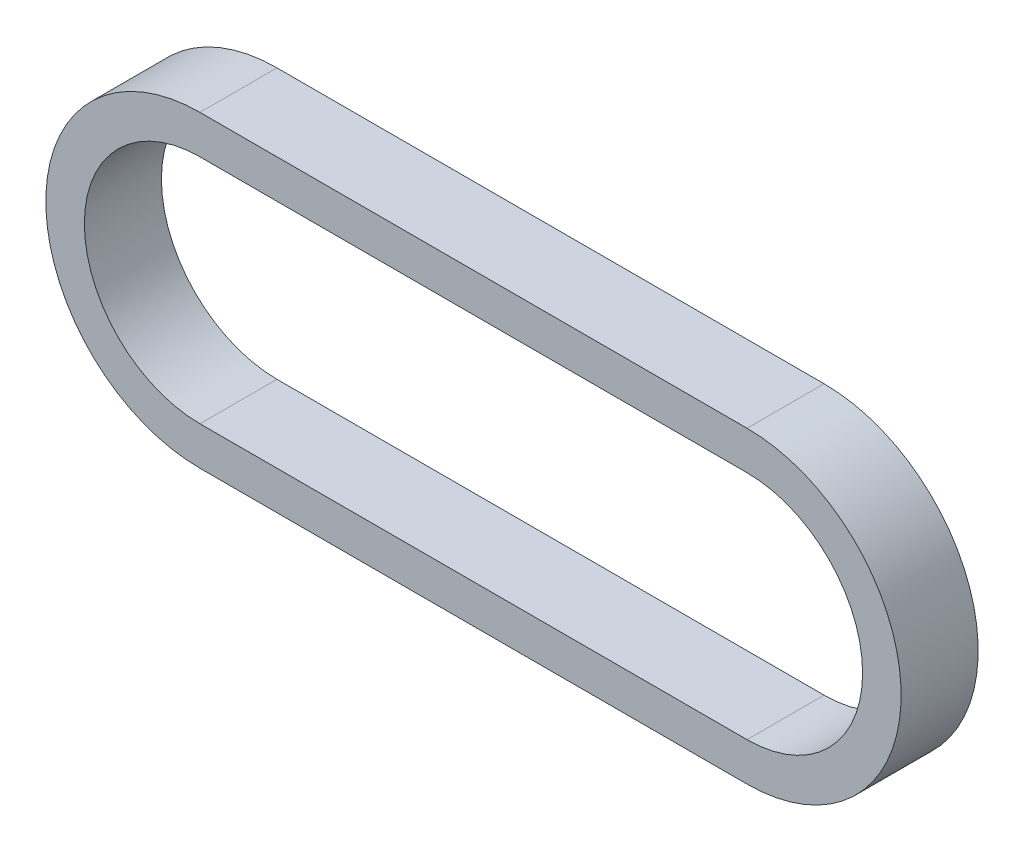
ISO-10303-21;
HEADER;
FILE_DESCRIPTION(('STEP AP214'),'2;1');
FILE_NAME('part.step','',(''),(''),'','','');
FILE_SCHEMA(('AUTOMOTIVE_DESIGN { 1 0 10303 214 1 1 1 1 }'));
ENDSEC;
DATA;
#1=APPLICATION_CONTEXT('core data for automotive mechanical design processes');
#2=APPLICATION_PROTOCOL_DEFINITION('international standard','automotive_design',2000,#1);
#3=PRODUCT_CONTEXT('',#1,'mechanical');
#4=PRODUCT('Part','Part','',(#3));
#5=PRODUCT_RELATED_PRODUCT_CATEGORY('part','',(#4));
#6=PRODUCT_DEFINITION_FORMATION('','',#4);
#7=PRODUCT_DEFINITION_CONTEXT('part definition',#1,'design');
#8=PRODUCT_DEFINITION('design','',#6,#7);
#9=PRODUCT_DEFINITION_SHAPE('','',#8);
#10=(LENGTH_UNIT() NAMED_UNIT(*) SI_UNIT(.MILLI.,.METRE.));
#11=(NAMED_UNIT(*) PLANE_ANGLE_UNIT() SI_UNIT($,.RADIAN.));
#12=(NAMED_UNIT(*) SI_UNIT($,.STERADIAN.) SOLID_ANGLE_UNIT());
#13=UNCERTAINTY_MEASURE_WITH_UNIT(LENGTH_MEASURE(1.E-05),#10,'distance_accuracy_value','');
#14=(GEOMETRIC_REPRESENTATION_CONTEXT(3) GLOBAL_UNCERTAINTY_ASSIGNED_CONTEXT((#13)) GLOBAL_UNIT_ASSIGNED_CONTEXT((#10,
#11,#12)) REPRESENTATION_CONTEXT('',''));
#15=CARTESIAN_POINT('',(0.,0.,0.));
#16=DIRECTION('',(0.,0.,1.));
#17=DIRECTION('',(1.,0.,0.));
#18=AXIS2_PLACEMENT_3D('',#15,#16,#17);
#19=CARTESIAN_POINT('',(0.,0.,10.));
#20=DIRECTION('',(0.,0.,1.));
#21=DIRECTION('',(1.,0.,0.));
#22=AXIS2_PLACEMENT_3D('',#19,#20,#21);
#23=PLANE('',#22);
#24=CARTESIAN_POINT('',(0.,0.,10.));
#25=DIRECTION('',(0.,0.,1.));
#26=DIRECTION('',(1.,0.,0.));
#27=AXIS2_PLACEMENT_3D('',#24,#25,#26);
#28=CIRCLE('',#27,20.);
#29=CARTESIAN_POINT('',(0.,20.,10.));
#30=VERTEX_POINT('',#29);
#31=CARTESIAN_POINT('',(0.,-20.,10.));
#32=VERTEX_POINT('',#31);
#33=EDGE_CURVE('E134',#30,#32,#28,.T.);
#34=ORIENTED_EDGE('',*,*,#33,.T.);
#35=DIRECTION('',(1.,0.,0.));
#36=VECTOR('',#35,1.);
#37=CARTESIAN_POINT('',(0.,-20.,10.));
#38=LINE('',#37,#36);
#39=CARTESIAN_POINT('',(71.,-20.,10.));
#40=VERTEX_POINT('',#39);
#41=EDGE_CURVE('E137',#32,#40,#38,.T.);
#42=ORIENTED_EDGE('',*,*,#41,.T.);
#43=CARTESIAN_POINT('',(71.,0.,10.));
#44=DIRECTION('',(0.,0.,1.));
#45=DIRECTION('',(1.,0.,0.));
#46=AXIS2_PLACEMENT_3D('',#43,#44,#45);
#47=CIRCLE('',#46,20.);
#48=CARTESIAN_POINT('',(71.,20.,10.));
#49=VERTEX_POINT('',#48);
#50=EDGE_CURVE('E140',#40,#49,#47,.T.);
#51=ORIENTED_EDGE('',*,*,#50,.T.);
#52=DIRECTION('',(-1.,0.,0.));
#53=VECTOR('',#52,1.);
#54=CARTESIAN_POINT('',(0.,20.,10.));
#55=LINE('',#54,#53);
#56=EDGE_CURVE('E142',#49,#30,#55,.T.);
#57=ORIENTED_EDGE('',*,*,#56,.T.);
#58=EDGE_LOOP('',(#34,#42,#51,#57));
#59=FACE_BOUND('',#58,.T.);
#60=DIRECTION('',(1.,0.,0.));
#61=VECTOR('',#60,1.);
#62=CARTESIAN_POINT('',(0.,-15.,10.));
#63=LINE('',#62,#61);
#64=CARTESIAN_POINT('',(0.,-15.,10.));
#65=VERTEX_POINT('',#64);
#66=CARTESIAN_POINT('',(71.,-15.,10.));
#67=VERTEX_POINT('',#66);
#68=EDGE_CURVE('E106',#65,#67,#63,.T.);
#69=ORIENTED_EDGE('',*,*,#68,.F.);
#70=CARTESIAN_POINT('',(0.,0.,10.));
#71=DIRECTION('',(0.,0.,1.));
#72=DIRECTION('',(1.,0.,0.));
#73=AXIS2_PLACEMENT_3D('',#70,#71,#72);
#74=CIRCLE('',#73,15.);
#75=CARTESIAN_POINT('',(0.,15.,10.));
#76=VERTEX_POINT('',#75);
#77=EDGE_CURVE('E98',#76,#65,#74,.T.);
#78=ORIENTED_EDGE('',*,*,#77,.F.);
#79=DIRECTION('',(-1.,0.,0.));
#80=VECTOR('',#79,1.);
#81=CARTESIAN_POINT('',(0.,15.,10.));
#82=LINE('',#81,#80);
#83=CARTESIAN_POINT('',(71.,15.,10.));
#84=VERTEX_POINT('',#83);
#85=EDGE_CURVE('E120',#84,#76,#82,.T.);
#86=ORIENTED_EDGE('',*,*,#85,.F.);
#87=CARTESIAN_POINT('',(71.,0.,10.));
#88=DIRECTION('',(0.,0.,1.));
#89=DIRECTION('',(1.,0.,0.));
#90=AXIS2_PLACEMENT_3D('',#87,#88,#89);
#91=CIRCLE('',#90,15.);
#92=EDGE_CURVE('E118',#67,#84,#91,.T.);
#93=ORIENTED_EDGE('',*,*,#92,.F.);
#94=EDGE_LOOP('',(#69,#78,#86,#93));
#95=FACE_BOUND('',#94,.T.);
#96=ADVANCED_FACE('F33',(#59,#95),#23,.T.);
#97=CARTESIAN_POINT('',(0.,0.,0.));
#98=DIRECTION('',(0.,0.,1.));
#99=DIRECTION('',(1.,0.,0.));
#100=AXIS2_PLACEMENT_3D('',#97,#98,#99);
#101=PLANE('',#100);
#102=CARTESIAN_POINT('',(0.,0.,0.));
#103=DIRECTION('',(0.,0.,1.));
#104=DIRECTION('',(1.,0.,0.));
#105=AXIS2_PLACEMENT_3D('',#102,#103,#104);
#106=CIRCLE('',#105,20.);
#107=CARTESIAN_POINT('',(0.,20.,0.));
#108=VERTEX_POINT('',#107);
#109=CARTESIAN_POINT('',(0.,-20.,0.));
#110=VERTEX_POINT('',#109);
#111=EDGE_CURVE('E114',#108,#110,#106,.T.);
#112=ORIENTED_EDGE('',*,*,#111,.F.);
#113=DIRECTION('',(-1.,0.,0.));
#114=VECTOR('',#113,1.);
#115=CARTESIAN_POINT('',(0.,20.,0.));
#116=LINE('',#115,#114);
#117=CARTESIAN_POINT('',(71.,20.,0.));
#118=VERTEX_POINT('',#117);
#119=EDGE_CURVE('E138',#118,#108,#116,.T.);
#120=ORIENTED_EDGE('',*,*,#119,.F.);
#121=CARTESIAN_POINT('',(71.,0.,0.));
#122=DIRECTION('',(0.,0.,1.));
#123=DIRECTION('',(1.,0.,0.));
#124=AXIS2_PLACEMENT_3D('',#121,#122,#123);
#125=CIRCLE('',#124,20.);
#126=CARTESIAN_POINT('',(71.,-20.,0.));
#127=VERTEX_POINT('',#126);
#128=EDGE_CURVE('E149',#127,#118,#125,.T.);
#129=ORIENTED_EDGE('',*,*,#128,.F.);
#130=DIRECTION('',(1.,0.,0.));
#131=VECTOR('',#130,1.);
#132=CARTESIAN_POINT('',(0.,-20.,0.));
#133=LINE('',#132,#131);
#134=EDGE_CURVE('E147',#110,#127,#133,.T.);
#135=ORIENTED_EDGE('',*,*,#134,.F.);
#136=EDGE_LOOP('',(#112,#120,#129,#135));
#137=FACE_BOUND('',#136,.T.);
#138=CARTESIAN_POINT('',(0.,0.,0.));
#139=DIRECTION('',(0.,0.,1.));
#140=DIRECTION('',(1.,0.,0.));
#141=AXIS2_PLACEMENT_3D('',#138,#139,#140);
#142=CIRCLE('',#141,15.);
#143=CARTESIAN_POINT('',(0.,15.,0.));
#144=VERTEX_POINT('',#143);
#145=CARTESIAN_POINT('',(0.,-15.,0.));
#146=VERTEX_POINT('',#145);
#147=EDGE_CURVE('E56',#144,#146,#142,.T.);
#148=ORIENTED_EDGE('',*,*,#147,.T.);
#149=DIRECTION('',(1.,0.,0.));
#150=VECTOR('',#149,1.);
#151=CARTESIAN_POINT('',(0.,-15.,0.));
#152=LINE('',#151,#150);
#153=CARTESIAN_POINT('',(71.,-15.,0.));
#154=VERTEX_POINT('',#153);
#155=EDGE_CURVE('E113',#146,#154,#152,.T.);
#156=ORIENTED_EDGE('',*,*,#155,.T.);
#157=CARTESIAN_POINT('',(71.,0.,0.));
#158=DIRECTION('',(0.,0.,1.));
#159=DIRECTION('',(1.,0.,0.));
#160=AXIS2_PLACEMENT_3D('',#157,#158,#159);
#161=CIRCLE('',#160,15.);
#162=CARTESIAN_POINT('',(71.,15.,0.));
#163=VERTEX_POINT('',#162);
#164=EDGE_CURVE('E126',#154,#163,#161,.T.);
#165=ORIENTED_EDGE('',*,*,#164,.T.);
#166=DIRECTION('',(-1.,0.,0.));
#167=VECTOR('',#166,1.);
#168=CARTESIAN_POINT('',(0.,15.,0.));
#169=LINE('',#168,#167);
#170=EDGE_CURVE('E107',#163,#144,#169,.T.);
#171=ORIENTED_EDGE('',*,*,#170,.T.);
#172=EDGE_LOOP('',(#148,#156,#165,#171));
#173=FACE_BOUND('',#172,.T.);
#174=ADVANCED_FACE('F167',(#137,#173),#101,.F.);
#175=CARTESIAN_POINT('',(0.,0.,10.));
#176=DIRECTION('',(0.,0.,-1.));
#177=DIRECTION('',(-1.,0.,0.));
#178=AXIS2_PLACEMENT_3D('',#175,#176,#177);
#179=CYLINDRICAL_SURFACE('',#178,20.);
#180=ORIENTED_EDGE('',*,*,#111,.T.);
#181=DIRECTION('',(0.,0.,-1.));
#182=VECTOR('',#181,1.);
#183=CARTESIAN_POINT('',(0.,-20.,10.));
#184=LINE('',#183,#182);
#185=EDGE_CURVE('E11',#32,#110,#184,.T.);
#186=ORIENTED_EDGE('',*,*,#185,.F.);
#187=ORIENTED_EDGE('',*,*,#33,.F.);
#188=DIRECTION('',(0.,0.,-1.));
#189=VECTOR('',#188,1.);
#190=CARTESIAN_POINT('',(0.,20.,10.));
#191=LINE('',#190,#189);
#192=EDGE_CURVE('E144',#30,#108,#191,.T.);
#193=ORIENTED_EDGE('',*,*,#192,.T.);
#194=EDGE_LOOP('',(#180,#186,#187,#193));
#195=FACE_BOUND('',#194,.T.);
#196=ADVANCED_FACE('F35',(#195),#179,.T.);
#197=CARTESIAN_POINT('',(0.,-20.,10.));
#198=DIRECTION('',(0.,1.,0.));
#199=DIRECTION('',(0.,0.,1.));
#200=AXIS2_PLACEMENT_3D('',#197,#198,#199);
#201=PLANE('',#200);
#202=ORIENTED_EDGE('',*,*,#134,.T.);
#203=DIRECTION('',(0.,0.,-1.));
#204=VECTOR('',#203,1.);
#205=CARTESIAN_POINT('',(71.,-20.,10.));
#206=LINE('',#205,#204);
#207=EDGE_CURVE('E41',#40,#127,#206,.T.);
#208=ORIENTED_EDGE('',*,*,#207,.F.);
#209=ORIENTED_EDGE('',*,*,#41,.F.);
#210=ORIENTED_EDGE('',*,*,#185,.T.);
#211=EDGE_LOOP('',(#202,#208,#209,#210));
#212=FACE_BOUND('',#211,.T.);
#213=ADVANCED_FACE('F177',(#212),#201,.F.);
#214=CARTESIAN_POINT('',(71.,0.,10.));
#215=DIRECTION('',(0.,0.,-1.));
#216=DIRECTION('',(-1.,0.,0.));
#217=AXIS2_PLACEMENT_3D('',#214,#215,#216);
#218=CYLINDRICAL_SURFACE('',#217,20.);
#219=ORIENTED_EDGE('',*,*,#128,.T.);
#220=DIRECTION('',(0.,0.,-1.));
#221=VECTOR('',#220,1.);
#222=CARTESIAN_POINT('',(71.,20.,10.));
#223=LINE('',#222,#221);
#224=EDGE_CURVE('E154',#49,#118,#223,.T.);
#225=ORIENTED_EDGE('',*,*,#224,.F.);
#226=ORIENTED_EDGE('',*,*,#50,.F.);
#227=ORIENTED_EDGE('',*,*,#207,.T.);
#228=EDGE_LOOP('',(#219,#225,#226,#227));
#229=FACE_BOUND('',#228,.T.);
#230=ADVANCED_FACE('F161',(#229),#218,.T.);
#231=CARTESIAN_POINT('',(0.,20.,10.));
#232=DIRECTION('',(0.,-1.,0.));
#233=DIRECTION('',(0.,0.,-1.));
#234=AXIS2_PLACEMENT_3D('',#231,#232,#233);
#235=PLANE('',#234);
#236=ORIENTED_EDGE('',*,*,#119,.T.);
#237=ORIENTED_EDGE('',*,*,#192,.F.);
#238=ORIENTED_EDGE('',*,*,#56,.F.);
#239=ORIENTED_EDGE('',*,*,#224,.T.);
#240=EDGE_LOOP('',(#236,#237,#238,#239));
#241=FACE_BOUND('',#240,.T.);
#242=ADVANCED_FACE('F171',(#241),#235,.F.);
#243=CARTESIAN_POINT('',(0.,0.,10.));
#244=DIRECTION('',(0.,0.,-1.));
#245=DIRECTION('',(-1.,0.,0.));
#246=AXIS2_PLACEMENT_3D('',#243,#244,#245);
#247=CYLINDRICAL_SURFACE('',#246,15.);
#248=ORIENTED_EDGE('',*,*,#147,.F.);
#249=DIRECTION('',(0.,0.,-1.));
#250=VECTOR('',#249,1.);
#251=CARTESIAN_POINT('',(0.,15.,10.));
#252=LINE('',#251,#250);
#253=EDGE_CURVE('E102',#76,#144,#252,.T.);
#254=ORIENTED_EDGE('',*,*,#253,.F.);
#255=ORIENTED_EDGE('',*,*,#77,.T.);
#256=DIRECTION('',(0.,0.,-1.));
#257=VECTOR('',#256,1.);
#258=CARTESIAN_POINT('',(0.,-15.,10.));
#259=LINE('',#258,#257);
#260=EDGE_CURVE('E101',#65,#146,#259,.T.);
#261=ORIENTED_EDGE('',*,*,#260,.T.);
#262=EDGE_LOOP('',(#248,#254,#255,#261));
#263=FACE_BOUND('',#262,.T.);
#264=ADVANCED_FACE('F100',(#263),#247,.F.);
#265=CARTESIAN_POINT('',(0.,-15.,10.));
#266=DIRECTION('',(0.,1.,0.));
#267=DIRECTION('',(0.,0.,1.));
#268=AXIS2_PLACEMENT_3D('',#265,#266,#267);
#269=PLANE('',#268);
#270=ORIENTED_EDGE('',*,*,#155,.F.);
#271=ORIENTED_EDGE('',*,*,#260,.F.);
#272=ORIENTED_EDGE('',*,*,#68,.T.);
#273=DIRECTION('',(0.,0.,-1.));
#274=VECTOR('',#273,1.);
#275=CARTESIAN_POINT('',(71.,-15.,10.));
#276=LINE('',#275,#274);
#277=EDGE_CURVE('E115',#67,#154,#276,.T.);
#278=ORIENTED_EDGE('',*,*,#277,.T.);
#279=EDGE_LOOP('',(#270,#271,#272,#278));
#280=FACE_BOUND('',#279,.T.);
#281=ADVANCED_FACE('F110',(#280),#269,.T.);
#282=CARTESIAN_POINT('',(71.,0.,10.));
#283=DIRECTION('',(0.,0.,-1.));
#284=DIRECTION('',(-1.,0.,0.));
#285=AXIS2_PLACEMENT_3D('',#282,#283,#284);
#286=CYLINDRICAL_SURFACE('',#285,15.);
#287=ORIENTED_EDGE('',*,*,#164,.F.);
#288=ORIENTED_EDGE('',*,*,#277,.F.);
#289=ORIENTED_EDGE('',*,*,#92,.T.);
#290=DIRECTION('',(0.,0.,-1.));
#291=VECTOR('',#290,1.);
#292=CARTESIAN_POINT('',(71.,15.,10.));
#293=LINE('',#292,#291);
#294=EDGE_CURVE('E48',#84,#163,#293,.T.);
#295=ORIENTED_EDGE('',*,*,#294,.T.);
#296=EDGE_LOOP('',(#287,#288,#289,#295));
#297=FACE_BOUND('',#296,.T.);
#298=ADVANCED_FACE('F200',(#297),#286,.F.);
#299=CARTESIAN_POINT('',(0.,15.,10.));
#300=DIRECTION('',(0.,-1.,0.));
#301=DIRECTION('',(0.,0.,-1.));
#302=AXIS2_PLACEMENT_3D('',#299,#300,#301);
#303=PLANE('',#302);
#304=ORIENTED_EDGE('',*,*,#170,.F.);
#305=ORIENTED_EDGE('',*,*,#294,.F.);
#306=ORIENTED_EDGE('',*,*,#85,.T.);
#307=ORIENTED_EDGE('',*,*,#253,.T.);
#308=EDGE_LOOP('',(#304,#305,#306,#307));
#309=FACE_BOUND('',#308,.T.);
#310=ADVANCED_FACE('F204',(#309),#303,.T.);
#311=CLOSED_SHELL('',(#96,#174,#196,#213,#230,#242,#264,#281,#298,#310));
#312=MANIFOLD_SOLID_BREP('B2',#311);
#313=ADVANCED_BREP_SHAPE_REPRESENTATION('',(#18,#312),#14);
#314=SHAPE_DEFINITION_REPRESENTATION(#9,#313);
ENDSEC;
END-ISO-10303-21;
